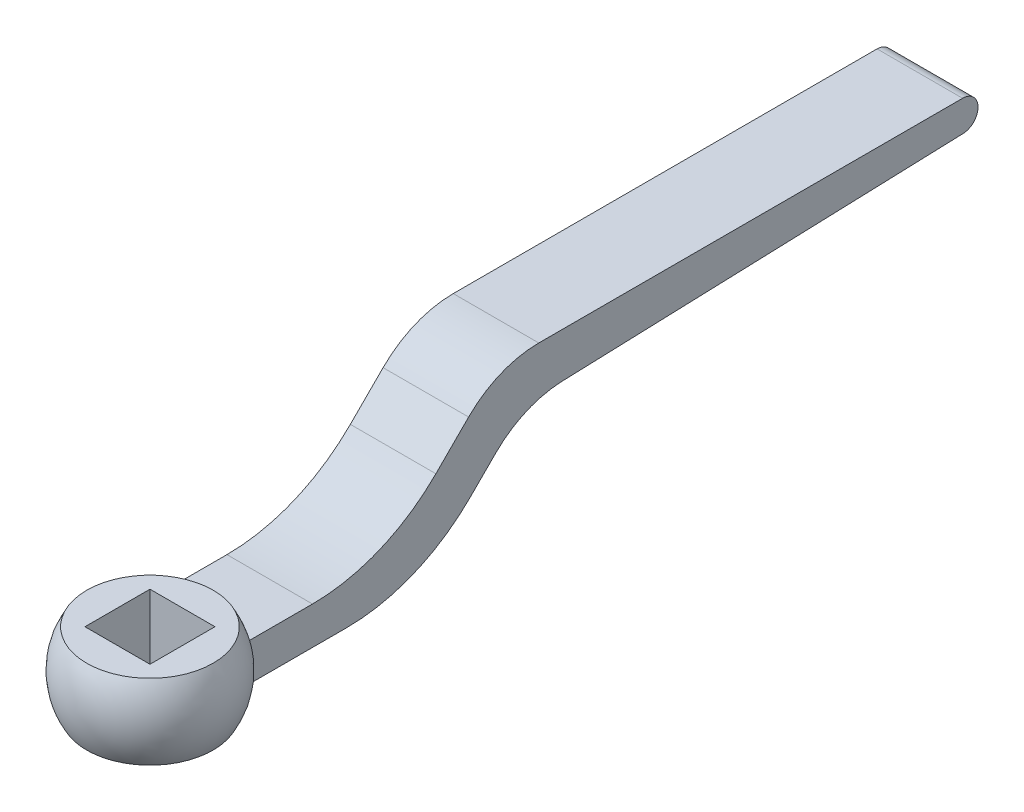
ISO-10303-21;
HEADER;
FILE_DESCRIPTION(('STEP AP214'),'2;1');
FILE_NAME('part.step','',(''),(''),'','','');
FILE_SCHEMA(('AUTOMOTIVE_DESIGN { 1 0 10303 214 1 1 1 1 }'));
ENDSEC;
DATA;
#1=APPLICATION_CONTEXT('core data for automotive mechanical design processes');
#2=APPLICATION_PROTOCOL_DEFINITION('international standard','automotive_design',2000,#1);
#3=PRODUCT_CONTEXT('',#1,'mechanical');
#4=PRODUCT('Part','Part','',(#3));
#5=PRODUCT_RELATED_PRODUCT_CATEGORY('part','',(#4));
#6=PRODUCT_DEFINITION_FORMATION('','',#4);
#7=PRODUCT_DEFINITION_CONTEXT('part definition',#1,'design');
#8=PRODUCT_DEFINITION('design','',#6,#7);
#9=PRODUCT_DEFINITION_SHAPE('','',#8);
#10=(LENGTH_UNIT() NAMED_UNIT(*) SI_UNIT(.MILLI.,.METRE.));
#11=(NAMED_UNIT(*) PLANE_ANGLE_UNIT() SI_UNIT($,.RADIAN.));
#12=(NAMED_UNIT(*) SI_UNIT($,.STERADIAN.) SOLID_ANGLE_UNIT());
#13=UNCERTAINTY_MEASURE_WITH_UNIT(LENGTH_MEASURE(1.E-05),#10,'distance_accuracy_value','');
#14=(GEOMETRIC_REPRESENTATION_CONTEXT(3) GLOBAL_UNCERTAINTY_ASSIGNED_CONTEXT((#13)) GLOBAL_UNIT_ASSIGNED_CONTEXT((#10,
#11,#12)) REPRESENTATION_CONTEXT('',''));
#15=CARTESIAN_POINT('',(0.,0.,0.));
#16=DIRECTION('',(0.,0.,1.));
#17=DIRECTION('',(1.,0.,0.));
#18=AXIS2_PLACEMENT_3D('',#15,#16,#17);
#19=CARTESIAN_POINT('',(0.,0.,15.));
#20=DIRECTION('',(0.,0.,1.));
#21=DIRECTION('',(0.,1.,0.));
#22=AXIS2_PLACEMENT_3D('',#19,#20,#21);
#23=SPHERICAL_SURFACE('',#22,21.5);
#24=CARTESIAN_POINT('',(0.,-11.,15.));
#25=DIRECTION('',(0.,1.,0.));
#26=DIRECTION('',(0.,0.,1.));
#27=AXIS2_PLACEMENT_3D('',#24,#25,#26);
#28=CIRCLE('',#27,18.4729532019112);
#29=CARTESIAN_POINT('',(0.,-11.,33.4729532019112));
#30=VERTEX_POINT('',#29);
#31=EDGE_CURVE('E54',#30,#30,#28,.T.);
#32=ORIENTED_EDGE('',*,*,#31,.T.);
#33=EDGE_LOOP('',(#32));
#34=FACE_BOUND('',#33,.T.);
#35=CARTESIAN_POINT('',(0.,11.,15.));
#36=DIRECTION('',(0.,-1.,0.));
#37=DIRECTION('',(0.,0.,-1.));
#38=AXIS2_PLACEMENT_3D('',#35,#36,#37);
#39=CIRCLE('',#38,18.4729532019112);
#40=CARTESIAN_POINT('',(0.,11.,-3.47295320191117));
#41=VERTEX_POINT('',#40);
#42=EDGE_CURVE('E334',#41,#41,#39,.T.);
#43=ORIENTED_EDGE('',*,*,#42,.T.);
#44=EDGE_LOOP('',(#43));
#45=FACE_BOUND('',#44,.T.);
#46=CARTESIAN_POINT('',(0.,-5.5,15.));
#47=DIRECTION('',(0.,1.,0.));
#48=DIRECTION('',(0.,0.,1.));
#49=AXIS2_PLACEMENT_3D('',#46,#47,#48);
#50=CIRCLE('',#49,20.7846096908265);
#51=CARTESIAN_POINT('',(-12.5,-5.5,-1.60572190541561));
#52=VERTEX_POINT('',#51);
#53=CARTESIAN_POINT('',(12.5,-5.5,-1.60572190541561));
#54=VERTEX_POINT('',#53);
#55=EDGE_CURVE('E216',#52,#54,#50,.F.);
#56=ORIENTED_EDGE('',*,*,#55,.T.);
#57=CARTESIAN_POINT('',(12.5,0.,15.));
#58=DIRECTION('',(-1.,0.,0.));
#59=DIRECTION('',(0.,0.,1.));
#60=AXIS2_PLACEMENT_3D('',#57,#58,#59);
#61=CIRCLE('',#60,17.4928556845359);
#62=CARTESIAN_POINT('',(12.5,5.5,-1.60572190541561));
#63=VERTEX_POINT('',#62);
#64=EDGE_CURVE('E219',#54,#63,#61,.F.);
#65=ORIENTED_EDGE('',*,*,#64,.T.);
#66=CARTESIAN_POINT('',(0.,5.5,15.));
#67=DIRECTION('',(0.,-1.,0.));
#68=DIRECTION('',(0.,0.,-1.));
#69=AXIS2_PLACEMENT_3D('',#66,#67,#68);
#70=CIRCLE('',#69,20.7846096908265);
#71=CARTESIAN_POINT('',(-12.5,5.5,-1.60572190541561));
#72=VERTEX_POINT('',#71);
#73=EDGE_CURVE('E213',#63,#72,#70,.F.);
#74=ORIENTED_EDGE('',*,*,#73,.T.);
#75=CARTESIAN_POINT('',(-12.5,0.,15.));
#76=DIRECTION('',(-1.,0.,0.));
#77=DIRECTION('',(0.,0.,1.));
#78=AXIS2_PLACEMENT_3D('',#75,#76,#77);
#79=CIRCLE('',#78,17.4928556845359);
#80=EDGE_CURVE('E330',#52,#72,#79,.F.);
#81=ORIENTED_EDGE('',*,*,#80,.F.);
#82=EDGE_LOOP('',(#56,#65,#74,#81));
#83=FACE_BOUND('',#82,.T.);
#84=ADVANCED_FACE('F45',(#34,#45,#83),#23,.T.);
#85=CARTESIAN_POINT('',(12.5,-5.5,-30.));
#86=DIRECTION('',(0.,1.,0.));
#87=DIRECTION('',(0.,0.,1.));
#88=AXIS2_PLACEMENT_3D('',#85,#86,#87);
#89=PLANE('',#88);
#90=CARTESIAN_POINT('',(-4.,-5.5,-8.00000000000001));
#91=DIRECTION('',(0.,1.,0.));
#92=DIRECTION('',(0.,0.,1.));
#93=AXIS2_PLACEMENT_3D('',#90,#91,#92);
#94=CIRCLE('',#93,1.5);
#95=CARTESIAN_POINT('',(-4.,-5.5,-6.50000000000001));
#96=VERTEX_POINT('',#95);
#97=EDGE_CURVE('E11',#96,#96,#94,.F.);
#98=ORIENTED_EDGE('',*,*,#97,.F.);
#99=EDGE_LOOP('',(#98));
#100=FACE_BOUND('',#99,.T.);
#101=ORIENTED_EDGE('',*,*,#55,.F.);
#102=DIRECTION('',(0.,0.,-1.));
#103=VECTOR('',#102,1.);
#104=CARTESIAN_POINT('',(-12.5,-5.5,-30.));
#105=LINE('',#104,#103);
#106=CARTESIAN_POINT('',(-12.5,-5.50000000000001,-30.));
#107=VERTEX_POINT('',#106);
#108=EDGE_CURVE('E222',#52,#107,#105,.T.);
#109=ORIENTED_EDGE('',*,*,#108,.T.);
#110=DIRECTION('',(-1.,0.,0.));
#111=VECTOR('',#110,1.);
#112=CARTESIAN_POINT('',(12.5,-5.50000000000001,-30.));
#113=LINE('',#112,#111);
#114=CARTESIAN_POINT('',(12.5,-5.50000000000001,-30.));
#115=VERTEX_POINT('',#114);
#116=EDGE_CURVE('E326',#115,#107,#113,.T.);
#117=ORIENTED_EDGE('',*,*,#116,.F.);
#118=DIRECTION('',(0.,0.,-1.));
#119=VECTOR('',#118,1.);
#120=CARTESIAN_POINT('',(12.5,-5.5,-30.));
#121=LINE('',#120,#119);
#122=EDGE_CURVE('E223',#54,#115,#121,.T.);
#123=ORIENTED_EDGE('',*,*,#122,.F.);
#124=EDGE_LOOP('',(#101,#109,#117,#123));
#125=FACE_BOUND('',#124,.T.);
#126=ADVANCED_FACE('F47',(#100,#125),#89,.F.);
#127=CARTESIAN_POINT('',(12.5,45.5,-30.));
#128=DIRECTION('',(-1.,0.,0.));
#129=DIRECTION('',(0.,0.,1.));
#130=AXIS2_PLACEMENT_3D('',#127,#128,#129);
#131=CYLINDRICAL_SURFACE('',#130,51.);
#132=CARTESIAN_POINT('',(-12.5,45.5,-30.));
#133=DIRECTION('',(1.,0.,0.));
#134=DIRECTION('',(0.,0.,1.));
#135=AXIS2_PLACEMENT_3D('',#132,#133,#134);
#136=CIRCLE('',#135,51.);
#137=CARTESIAN_POINT('',(-12.5,9.43755415948588,-66.0624458405137));
#138=VERTEX_POINT('',#137);
#139=EDGE_CURVE('E261',#107,#138,#136,.T.);
#140=ORIENTED_EDGE('',*,*,#139,.T.);
#141=DIRECTION('',(-1.,0.,0.));
#142=VECTOR('',#141,1.);
#143=CARTESIAN_POINT('',(12.5,9.43755415948588,-66.0624458405137));
#144=LINE('',#143,#142);
#145=CARTESIAN_POINT('',(12.5,9.43755415948588,-66.0624458405137));
#146=VERTEX_POINT('',#145);
#147=EDGE_CURVE('E322',#146,#138,#144,.T.);
#148=ORIENTED_EDGE('',*,*,#147,.F.);
#149=CARTESIAN_POINT('',(12.5,45.5,-30.));
#150=DIRECTION('',(1.,0.,0.));
#151=DIRECTION('',(0.,0.,1.));
#152=AXIS2_PLACEMENT_3D('',#149,#150,#151);
#153=CIRCLE('',#152,51.);
#154=EDGE_CURVE('E226',#115,#146,#153,.T.);
#155=ORIENTED_EDGE('',*,*,#154,.F.);
#156=ORIENTED_EDGE('',*,*,#116,.T.);
#157=EDGE_LOOP('',(#140,#148,#155,#156));
#158=FACE_BOUND('',#157,.T.);
#159=ADVANCED_FACE('F360',(#158),#131,.T.);
#160=CARTESIAN_POINT('',(12.5,16.9344084148553,-73.5593000958833));
#161=DIRECTION('',(0.,0.707106781186551,0.707106781186544));
#162=DIRECTION('',(0.,-0.707106781186544,0.707106781186551));
#163=AXIS2_PLACEMENT_3D('',#160,#161,#162);
#164=PLANE('',#163);
#165=DIRECTION('',(0.,0.707106781186544,-0.707106781186551));
#166=VECTOR('',#165,1.);
#167=CARTESIAN_POINT('',(-12.5,16.9344084148553,-73.5593000958833));
#168=LINE('',#167,#166);
#169=CARTESIAN_POINT('',(-12.5,16.9344084148553,-73.5593000958833));
#170=VERTEX_POINT('',#169);
#171=EDGE_CURVE('E264',#138,#170,#168,.T.);
#172=ORIENTED_EDGE('',*,*,#171,.T.);
#173=DIRECTION('',(-1.,0.,0.));
#174=VECTOR('',#173,1.);
#175=CARTESIAN_POINT('',(12.5,16.9344084148553,-73.5593000958833));
#176=LINE('',#175,#174);
#177=CARTESIAN_POINT('',(12.5,16.9344084148553,-73.5593000958833));
#178=VERTEX_POINT('',#177);
#179=EDGE_CURVE('E318',#178,#170,#176,.T.);
#180=ORIENTED_EDGE('',*,*,#179,.F.);
#181=DIRECTION('',(0.,0.707106781186544,-0.707106781186551));
#182=VECTOR('',#181,1.);
#183=CARTESIAN_POINT('',(12.5,16.9344084148553,-73.5593000958833));
#184=LINE('',#183,#182);
#185=EDGE_CURVE('E230',#146,#178,#184,.T.);
#186=ORIENTED_EDGE('',*,*,#185,.F.);
#187=ORIENTED_EDGE('',*,*,#147,.T.);
#188=EDGE_LOOP('',(#172,#180,#186,#187));
#189=FACE_BOUND('',#188,.T.);
#190=ADVANCED_FACE('F400',(#189),#164,.F.);
#191=CARTESIAN_POINT('',(12.5,-3.57168823955465,-94.065396750293));
#192=DIRECTION('',(-1.,0.,0.));
#193=DIRECTION('',(0.,0.,1.));
#194=AXIS2_PLACEMENT_3D('',#191,#192,#193);
#195=CYLINDRICAL_SURFACE('',#194,29.);
#196=CARTESIAN_POINT('',(-12.5,-3.57168823955465,-94.065396750293));
#197=DIRECTION('',(-1.,0.,0.));
#198=DIRECTION('',(0.,0.,-1.));
#199=AXIS2_PLACEMENT_3D('',#196,#197,#198);
#200=CIRCLE('',#199,29.);
#201=CARTESIAN_POINT('',(-12.5,25.4106457439991,-93.0533113459207));
#202=VERTEX_POINT('',#201);
#203=EDGE_CURVE('E267',#170,#202,#200,.T.);
#204=ORIENTED_EDGE('',*,*,#203,.T.);
#205=DIRECTION('',(-1.,0.,0.));
#206=VECTOR('',#205,1.);
#207=CARTESIAN_POINT('',(12.5,25.4106457439991,-93.0533113459207));
#208=LINE('',#207,#206);
#209=CARTESIAN_POINT('',(12.5,25.4106457439991,-93.0533113459207));
#210=VERTEX_POINT('',#209);
#211=EDGE_CURVE('E314',#210,#202,#208,.T.);
#212=ORIENTED_EDGE('',*,*,#211,.F.);
#213=CARTESIAN_POINT('',(12.5,-3.57168823955465,-94.065396750293));
#214=DIRECTION('',(-1.,0.,0.));
#215=DIRECTION('',(0.,0.,-1.));
#216=AXIS2_PLACEMENT_3D('',#213,#214,#215);
#217=CIRCLE('',#216,29.);
#218=EDGE_CURVE('E233',#178,#210,#217,.T.);
#219=ORIENTED_EDGE('',*,*,#218,.F.);
#220=ORIENTED_EDGE('',*,*,#179,.T.);
#221=EDGE_LOOP('',(#204,#212,#219,#220));
#222=FACE_BOUND('',#221,.T.);
#223=ADVANCED_FACE('F396',(#222),#195,.F.);
#224=CARTESIAN_POINT('',(12.5,29.5,-210.157095584354));
#225=DIRECTION('',(0.,0.999390827019096,0.0348994967024941));
#226=DIRECTION('',(0.,-0.0348994967024941,0.999390827019096));
#227=AXIS2_PLACEMENT_3D('',#224,#225,#226);
#228=PLANE('',#227);
#229=DIRECTION('',(0.,0.0348994967024941,-0.999390827019096));
#230=VECTOR('',#229,1.);
#231=CARTESIAN_POINT('',(-12.5,29.5,-210.157095584354));
#232=LINE('',#231,#230);
#233=CARTESIAN_POINT('',(-12.5,29.5,-210.157095584354));
#234=VERTEX_POINT('',#233);
#235=EDGE_CURVE('E270',#202,#234,#232,.T.);
#236=ORIENTED_EDGE('',*,*,#235,.T.);
#237=DIRECTION('',(-1.,0.,0.));
#238=VECTOR('',#237,1.);
#239=CARTESIAN_POINT('',(12.5,29.5,-210.157095584354));
#240=LINE('',#239,#238);
#241=CARTESIAN_POINT('',(12.5,29.5,-210.157095584354));
#242=VERTEX_POINT('',#241);
#243=EDGE_CURVE('E310',#242,#234,#240,.T.);
#244=ORIENTED_EDGE('',*,*,#243,.F.);
#245=DIRECTION('',(0.,0.0348994967024941,-0.999390827019096));
#246=VECTOR('',#245,1.);
#247=CARTESIAN_POINT('',(12.5,29.5,-210.157095584354));
#248=LINE('',#247,#246);
#249=EDGE_CURVE('E236',#210,#242,#248,.T.);
#250=ORIENTED_EDGE('',*,*,#249,.F.);
#251=ORIENTED_EDGE('',*,*,#211,.T.);
#252=EDGE_LOOP('',(#236,#244,#250,#251));
#253=FACE_BOUND('',#252,.T.);
#254=ADVANCED_FACE('F392',(#253),#228,.F.);
#255=CARTESIAN_POINT('',(12.5,33.9986289431876,-210.));
#256=DIRECTION('',(-1.,0.,0.));
#257=DIRECTION('',(0.,0.,1.));
#258=AXIS2_PLACEMENT_3D('',#255,#256,#257);
#259=CYLINDRICAL_SURFACE('',#258,4.50137105681242);
#260=CARTESIAN_POINT('',(-12.5,33.9986289431876,-210.));
#261=DIRECTION('',(1.,0.,0.));
#262=DIRECTION('',(0.,0.,-1.));
#263=AXIS2_PLACEMENT_3D('',#260,#261,#262);
#264=CIRCLE('',#263,4.50137105681242);
#265=CARTESIAN_POINT('',(-12.5,38.5,-210.));
#266=VERTEX_POINT('',#265);
#267=EDGE_CURVE('E273',#234,#266,#264,.T.);
#268=ORIENTED_EDGE('',*,*,#267,.T.);
#269=DIRECTION('',(-1.,0.,0.));
#270=VECTOR('',#269,1.);
#271=CARTESIAN_POINT('',(12.5,38.5,-210.));
#272=LINE('',#271,#270);
#273=CARTESIAN_POINT('',(12.5,38.5,-210.));
#274=VERTEX_POINT('',#273);
#275=EDGE_CURVE('E306',#274,#266,#272,.T.);
#276=ORIENTED_EDGE('',*,*,#275,.F.);
#277=CARTESIAN_POINT('',(12.5,33.9986289431876,-210.));
#278=DIRECTION('',(1.,0.,0.));
#279=DIRECTION('',(0.,0.,-1.));
#280=AXIS2_PLACEMENT_3D('',#277,#278,#279);
#281=CIRCLE('',#280,4.50137105681242);
#282=EDGE_CURVE('E239',#242,#274,#281,.T.);
#283=ORIENTED_EDGE('',*,*,#282,.F.);
#284=ORIENTED_EDGE('',*,*,#243,.T.);
#285=EDGE_LOOP('',(#268,#276,#283,#284));
#286=FACE_BOUND('',#285,.T.);
#287=ADVANCED_FACE('F388',(#286),#259,.T.);
#288=CARTESIAN_POINT('',(12.5,38.5,-86.1370849898477));
#289=DIRECTION('',(0.,-1.,0.));
#290=DIRECTION('',(0.,0.,-1.));
#291=AXIS2_PLACEMENT_3D('',#288,#289,#290);
#292=PLANE('',#291);
#293=DIRECTION('',(0.,0.,1.));
#294=VECTOR('',#293,1.);
#295=CARTESIAN_POINT('',(-12.5,38.5,-86.1370849898477));
#296=LINE('',#295,#294);
#297=CARTESIAN_POINT('',(-12.5,38.5,-86.1370849898477));
#298=VERTEX_POINT('',#297);
#299=EDGE_CURVE('E276',#266,#298,#296,.T.);
#300=ORIENTED_EDGE('',*,*,#299,.T.);
#301=DIRECTION('',(-1.,0.,0.));
#302=VECTOR('',#301,1.);
#303=CARTESIAN_POINT('',(12.5,38.5,-86.1370849898477));
#304=LINE('',#303,#302);
#305=CARTESIAN_POINT('',(12.5,38.5,-86.1370849898477));
#306=VERTEX_POINT('',#305);
#307=EDGE_CURVE('E302',#306,#298,#304,.T.);
#308=ORIENTED_EDGE('',*,*,#307,.F.);
#309=DIRECTION('',(0.,0.,1.));
#310=VECTOR('',#309,1.);
#311=CARTESIAN_POINT('',(12.5,38.5,-86.1370849898477));
#312=LINE('',#311,#310);
#313=EDGE_CURVE('E242',#274,#306,#312,.T.);
#314=ORIENTED_EDGE('',*,*,#313,.F.);
#315=ORIENTED_EDGE('',*,*,#275,.T.);
#316=EDGE_LOOP('',(#300,#308,#314,#315));
#317=FACE_BOUND('',#316,.T.);
#318=ADVANCED_FACE('F384',(#317),#292,.F.);
#319=CARTESIAN_POINT('',(12.5,9.5,-86.1370849898477));
#320=DIRECTION('',(-1.,0.,0.));
#321=DIRECTION('',(0.,0.,1.));
#322=AXIS2_PLACEMENT_3D('',#319,#320,#321);
#323=CYLINDRICAL_SURFACE('',#322,29.);
#324=CARTESIAN_POINT('',(-12.5,9.5,-86.1370849898477));
#325=DIRECTION('',(1.,0.,0.));
#326=DIRECTION('',(0.,0.,-1.));
#327=AXIS2_PLACEMENT_3D('',#324,#325,#326);
#328=CIRCLE('',#327,29.);
#329=CARTESIAN_POINT('',(-12.5,30.00609665441,-65.6309883354379));
#330=VERTEX_POINT('',#329);
#331=EDGE_CURVE('E279',#298,#330,#328,.T.);
#332=ORIENTED_EDGE('',*,*,#331,.T.);
#333=DIRECTION('',(-1.,0.,0.));
#334=VECTOR('',#333,1.);
#335=CARTESIAN_POINT('',(12.5,30.00609665441,-65.6309883354379));
#336=LINE('',#335,#334);
#337=CARTESIAN_POINT('',(12.5,30.00609665441,-65.6309883354379));
#338=VERTEX_POINT('',#337);
#339=EDGE_CURVE('E298',#338,#330,#336,.T.);
#340=ORIENTED_EDGE('',*,*,#339,.F.);
#341=CARTESIAN_POINT('',(12.5,9.5,-86.1370849898477));
#342=DIRECTION('',(1.,0.,0.));
#343=DIRECTION('',(0.,0.,-1.));
#344=AXIS2_PLACEMENT_3D('',#341,#342,#343);
#345=CIRCLE('',#344,29.);
#346=EDGE_CURVE('E245',#306,#338,#345,.T.);
#347=ORIENTED_EDGE('',*,*,#346,.F.);
#348=ORIENTED_EDGE('',*,*,#307,.T.);
#349=EDGE_LOOP('',(#332,#340,#347,#348));
#350=FACE_BOUND('',#349,.T.);
#351=ADVANCED_FACE('F380',(#350),#323,.T.);
#352=CARTESIAN_POINT('',(12.5,20.4375541594859,-56.0624458405137));
#353=DIRECTION('',(0.,-0.707106781186552,-0.707106781186543));
#354=DIRECTION('',(0.,0.707106781186543,-0.707106781186552));
#355=AXIS2_PLACEMENT_3D('',#352,#353,#354);
#356=PLANE('',#355);
#357=DIRECTION('',(0.,-0.707106781186543,0.707106781186552));
#358=VECTOR('',#357,1.);
#359=CARTESIAN_POINT('',(-12.5,20.4375541594859,-56.0624458405137));
#360=LINE('',#359,#358);
#361=CARTESIAN_POINT('',(-12.5,20.4375541594859,-56.0624458405137));
#362=VERTEX_POINT('',#361);
#363=EDGE_CURVE('E282',#330,#362,#360,.T.);
#364=ORIENTED_EDGE('',*,*,#363,.T.);
#365=DIRECTION('',(-1.,0.,0.));
#366=VECTOR('',#365,1.);
#367=CARTESIAN_POINT('',(12.5,20.4375541594859,-56.0624458405137));
#368=LINE('',#367,#366);
#369=CARTESIAN_POINT('',(12.5,20.4375541594859,-56.0624458405137));
#370=VERTEX_POINT('',#369);
#371=EDGE_CURVE('E294',#370,#362,#368,.T.);
#372=ORIENTED_EDGE('',*,*,#371,.F.);
#373=DIRECTION('',(0.,-0.707106781186543,0.707106781186552));
#374=VECTOR('',#373,1.);
#375=CARTESIAN_POINT('',(12.5,20.4375541594859,-56.0624458405137));
#376=LINE('',#375,#374);
#377=EDGE_CURVE('E248',#338,#370,#376,.T.);
#378=ORIENTED_EDGE('',*,*,#377,.F.);
#379=ORIENTED_EDGE('',*,*,#339,.T.);
#380=EDGE_LOOP('',(#364,#372,#378,#379));
#381=FACE_BOUND('',#380,.T.);
#382=ADVANCED_FACE('F376',(#381),#356,.F.);
#383=CARTESIAN_POINT('',(12.5,56.5,-20.));
#384=DIRECTION('',(-1.,0.,0.));
#385=DIRECTION('',(0.,0.,1.));
#386=AXIS2_PLACEMENT_3D('',#383,#384,#385);
#387=CYLINDRICAL_SURFACE('',#386,51.);
#388=CARTESIAN_POINT('',(-12.5,56.5,-20.));
#389=DIRECTION('',(-1.,0.,0.));
#390=DIRECTION('',(0.,0.,1.));
#391=AXIS2_PLACEMENT_3D('',#388,#389,#390);
#392=CIRCLE('',#391,51.);
#393=CARTESIAN_POINT('',(-12.5,5.5,-20.));
#394=VERTEX_POINT('',#393);
#395=EDGE_CURVE('E285',#362,#394,#392,.T.);
#396=ORIENTED_EDGE('',*,*,#395,.T.);
#397=DIRECTION('',(-1.,0.,0.));
#398=VECTOR('',#397,1.);
#399=CARTESIAN_POINT('',(12.5,5.5,-20.));
#400=LINE('',#399,#398);
#401=CARTESIAN_POINT('',(12.5,5.5,-20.));
#402=VERTEX_POINT('',#401);
#403=EDGE_CURVE('E258',#402,#394,#400,.T.);
#404=ORIENTED_EDGE('',*,*,#403,.F.);
#405=CARTESIAN_POINT('',(12.5,56.5,-20.));
#406=DIRECTION('',(-1.,0.,0.));
#407=DIRECTION('',(0.,0.,1.));
#408=AXIS2_PLACEMENT_3D('',#405,#406,#407);
#409=CIRCLE('',#408,51.);
#410=EDGE_CURVE('E251',#370,#402,#409,.T.);
#411=ORIENTED_EDGE('',*,*,#410,.F.);
#412=ORIENTED_EDGE('',*,*,#371,.T.);
#413=EDGE_LOOP('',(#396,#404,#411,#412));
#414=FACE_BOUND('',#413,.T.);
#415=ADVANCED_FACE('F372',(#414),#387,.F.);
#416=CARTESIAN_POINT('',(12.5,5.5,0.));
#417=DIRECTION('',(0.,-1.,0.));
#418=DIRECTION('',(0.,0.,-1.));
#419=AXIS2_PLACEMENT_3D('',#416,#417,#418);
#420=PLANE('',#419);
#421=ORIENTED_EDGE('',*,*,#73,.F.);
#422=DIRECTION('',(0.,0.,1.));
#423=VECTOR('',#422,1.);
#424=CARTESIAN_POINT('',(12.5,5.5,0.));
#425=LINE('',#424,#423);
#426=EDGE_CURVE('E254',#402,#63,#425,.T.);
#427=ORIENTED_EDGE('',*,*,#426,.F.);
#428=ORIENTED_EDGE('',*,*,#403,.T.);
#429=DIRECTION('',(0.,0.,1.));
#430=VECTOR('',#429,1.);
#431=CARTESIAN_POINT('',(-12.5,5.5,0.));
#432=LINE('',#431,#430);
#433=EDGE_CURVE('E227',#394,#72,#432,.T.);
#434=ORIENTED_EDGE('',*,*,#433,.T.);
#435=EDGE_LOOP('',(#421,#427,#428,#434));
#436=FACE_BOUND('',#435,.T.);
#437=ADVANCED_FACE('F366',(#436),#420,.F.);
#438=CARTESIAN_POINT('',(12.5,56.5,-20.));
#439=DIRECTION('',(-1.,0.,0.));
#440=DIRECTION('',(0.,0.,1.));
#441=AXIS2_PLACEMENT_3D('',#438,#439,#440);
#442=PLANE('',#441);
#443=ORIENTED_EDGE('',*,*,#64,.F.);
#444=ORIENTED_EDGE('',*,*,#122,.T.);
#445=ORIENTED_EDGE('',*,*,#154,.T.);
#446=ORIENTED_EDGE('',*,*,#185,.T.);
#447=ORIENTED_EDGE('',*,*,#218,.T.);
#448=ORIENTED_EDGE('',*,*,#249,.T.);
#449=ORIENTED_EDGE('',*,*,#282,.T.);
#450=ORIENTED_EDGE('',*,*,#313,.T.);
#451=ORIENTED_EDGE('',*,*,#346,.T.);
#452=ORIENTED_EDGE('',*,*,#377,.T.);
#453=ORIENTED_EDGE('',*,*,#410,.T.);
#454=ORIENTED_EDGE('',*,*,#426,.T.);
#455=EDGE_LOOP('',(#443,#444,#445,#446,#447,#448,#449,#450,#451,#452,#453,#454));
#456=FACE_BOUND('',#455,.T.);
#457=ADVANCED_FACE('F363',(#456),#442,.F.);
#458=CARTESIAN_POINT('',(-12.5,56.5,-20.));
#459=DIRECTION('',(-1.,0.,0.));
#460=DIRECTION('',(0.,0.,1.));
#461=AXIS2_PLACEMENT_3D('',#458,#459,#460);
#462=PLANE('',#461);
#463=ORIENTED_EDGE('',*,*,#108,.F.);
#464=ORIENTED_EDGE('',*,*,#80,.T.);
#465=ORIENTED_EDGE('',*,*,#433,.F.);
#466=ORIENTED_EDGE('',*,*,#395,.F.);
#467=ORIENTED_EDGE('',*,*,#363,.F.);
#468=ORIENTED_EDGE('',*,*,#331,.F.);
#469=ORIENTED_EDGE('',*,*,#299,.F.);
#470=ORIENTED_EDGE('',*,*,#267,.F.);
#471=ORIENTED_EDGE('',*,*,#235,.F.);
#472=ORIENTED_EDGE('',*,*,#203,.F.);
#473=ORIENTED_EDGE('',*,*,#171,.F.);
#474=ORIENTED_EDGE('',*,*,#139,.F.);
#475=EDGE_LOOP('',(#463,#464,#465,#466,#467,#468,#469,#470,#471,#472,#473,#474));
#476=FACE_BOUND('',#475,.T.);
#477=ADVANCED_FACE('F351',(#476),#462,.T.);
#478=CARTESIAN_POINT('',(-21.5,11.,33.4729532019112));
#479=DIRECTION('',(0.,-1.,0.));
#480=DIRECTION('',(0.,0.,-1.));
#481=AXIS2_PLACEMENT_3D('',#478,#479,#480);
#482=PLANE('',#481);
#483=DIRECTION('',(1.,0.,0.));
#484=VECTOR('',#483,1.);
#485=CARTESIAN_POINT('',(-21.5,11.,5.50000000000001));
#486=LINE('',#485,#484);
#487=CARTESIAN_POINT('',(-9.5,11.,5.5));
#488=VERTEX_POINT('',#487);
#489=CARTESIAN_POINT('',(9.5,11.,5.50000000000001));
#490=VERTEX_POINT('',#489);
#491=EDGE_CURVE('E194',#488,#490,#486,.T.);
#492=ORIENTED_EDGE('',*,*,#491,.T.);
#493=DIRECTION('',(0.,0.,1.));
#494=VECTOR('',#493,1.);
#495=CARTESIAN_POINT('',(9.50000000000001,11.,33.4729532019112));
#496=LINE('',#495,#494);
#497=CARTESIAN_POINT('',(9.5,11.,24.5));
#498=VERTEX_POINT('',#497);
#499=EDGE_CURVE('E165',#490,#498,#496,.T.);
#500=ORIENTED_EDGE('',*,*,#499,.T.);
#501=DIRECTION('',(-1.,0.,0.));
#502=VECTOR('',#501,1.);
#503=CARTESIAN_POINT('',(-21.5,11.,24.5));
#504=LINE('',#503,#502);
#505=CARTESIAN_POINT('',(-9.5,11.,24.5));
#506=VERTEX_POINT('',#505);
#507=EDGE_CURVE('E207',#498,#506,#504,.T.);
#508=ORIENTED_EDGE('',*,*,#507,.T.);
#509=DIRECTION('',(0.,0.,-1.));
#510=VECTOR('',#509,1.);
#511=CARTESIAN_POINT('',(-9.49999999999999,11.,33.4729532019112));
#512=LINE('',#511,#510);
#513=EDGE_CURVE('E203',#506,#488,#512,.T.);
#514=ORIENTED_EDGE('',*,*,#513,.T.);
#515=EDGE_LOOP('',(#492,#500,#508,#514));
#516=FACE_BOUND('',#515,.T.);
#517=ORIENTED_EDGE('',*,*,#42,.F.);
#518=EDGE_LOOP('',(#517));
#519=FACE_BOUND('',#518,.T.);
#520=ADVANCED_FACE('F343',(#516,#519),#482,.F.);
#521=CARTESIAN_POINT('',(-21.5,-11.,33.4729532019112));
#522=DIRECTION('',(0.,1.,0.));
#523=DIRECTION('',(0.,0.,1.));
#524=AXIS2_PLACEMENT_3D('',#521,#522,#523);
#525=PLANE('',#524);
#526=DIRECTION('',(1.,0.,0.));
#527=VECTOR('',#526,1.);
#528=CARTESIAN_POINT('',(-9.5,-11.,24.5));
#529=LINE('',#528,#527);
#530=CARTESIAN_POINT('',(-9.5,-11.,24.5));
#531=VERTEX_POINT('',#530);
#532=CARTESIAN_POINT('',(9.5,-11.,24.5));
#533=VERTEX_POINT('',#532);
#534=EDGE_CURVE('E169',#531,#533,#529,.T.);
#535=ORIENTED_EDGE('',*,*,#534,.T.);
#536=DIRECTION('',(0.,0.,-1.));
#537=VECTOR('',#536,1.);
#538=CARTESIAN_POINT('',(9.5,-11.,5.5));
#539=LINE('',#538,#537);
#540=CARTESIAN_POINT('',(9.5,-11.,5.5));
#541=VERTEX_POINT('',#540);
#542=EDGE_CURVE('E162',#533,#541,#539,.T.);
#543=ORIENTED_EDGE('',*,*,#542,.T.);
#544=DIRECTION('',(-1.,0.,0.));
#545=VECTOR('',#544,1.);
#546=CARTESIAN_POINT('',(-9.5,-11.,5.5));
#547=LINE('',#546,#545);
#548=CARTESIAN_POINT('',(-9.5,-11.,5.5));
#549=VERTEX_POINT('',#548);
#550=EDGE_CURVE('E172',#541,#549,#547,.T.);
#551=ORIENTED_EDGE('',*,*,#550,.T.);
#552=DIRECTION('',(0.,0.,1.));
#553=VECTOR('',#552,1.);
#554=CARTESIAN_POINT('',(-9.5,-11.,5.5));
#555=LINE('',#554,#553);
#556=EDGE_CURVE('E69',#549,#531,#555,.T.);
#557=ORIENTED_EDGE('',*,*,#556,.T.);
#558=EDGE_LOOP('',(#535,#543,#551,#557));
#559=FACE_BOUND('',#558,.T.);
#560=ORIENTED_EDGE('',*,*,#31,.F.);
#561=EDGE_LOOP('',(#560));
#562=FACE_BOUND('',#561,.T.);
#563=ADVANCED_FACE('F177',(#559,#562),#525,.F.);
#564=CARTESIAN_POINT('',(9.5,-11.,5.5));
#565=DIRECTION('',(1.,0.,0.));
#566=DIRECTION('',(0.,0.,-1.));
#567=AXIS2_PLACEMENT_3D('',#564,#565,#566);
#568=PLANE('',#567);
#569=DIRECTION('',(0.,1.,0.));
#570=VECTOR('',#569,1.);
#571=CARTESIAN_POINT('',(9.5,-11.,5.5));
#572=LINE('',#571,#570);
#573=EDGE_CURVE('E61',#541,#490,#572,.T.);
#574=ORIENTED_EDGE('',*,*,#573,.F.);
#575=ORIENTED_EDGE('',*,*,#542,.F.);
#576=DIRECTION('',(0.,1.,0.));
#577=VECTOR('',#576,1.);
#578=CARTESIAN_POINT('',(9.5,-11.,24.5));
#579=LINE('',#578,#577);
#580=EDGE_CURVE('E191',#533,#498,#579,.T.);
#581=ORIENTED_EDGE('',*,*,#580,.T.);
#582=ORIENTED_EDGE('',*,*,#499,.F.);
#583=EDGE_LOOP('',(#574,#575,#581,#582));
#584=FACE_BOUND('',#583,.T.);
#585=ADVANCED_FACE('F159',(#584),#568,.F.);
#586=CARTESIAN_POINT('',(-9.5,-11.,24.5));
#587=DIRECTION('',(0.,0.,1.));
#588=DIRECTION('',(0.,-1.,0.));
#589=AXIS2_PLACEMENT_3D('',#586,#587,#588);
#590=PLANE('',#589);
#591=ORIENTED_EDGE('',*,*,#580,.F.);
#592=ORIENTED_EDGE('',*,*,#534,.F.);
#593=DIRECTION('',(0.,1.,0.));
#594=VECTOR('',#593,1.);
#595=CARTESIAN_POINT('',(-9.5,-11.,24.5));
#596=LINE('',#595,#594);
#597=EDGE_CURVE('E195',#531,#506,#596,.T.);
#598=ORIENTED_EDGE('',*,*,#597,.T.);
#599=ORIENTED_EDGE('',*,*,#507,.F.);
#600=EDGE_LOOP('',(#591,#592,#598,#599));
#601=FACE_BOUND('',#600,.T.);
#602=ADVANCED_FACE('F349',(#601),#590,.F.);
#603=CARTESIAN_POINT('',(-9.5,-11.,5.5));
#604=DIRECTION('',(-1.,0.,0.));
#605=DIRECTION('',(0.,0.,1.));
#606=AXIS2_PLACEMENT_3D('',#603,#604,#605);
#607=PLANE('',#606);
#608=ORIENTED_EDGE('',*,*,#597,.F.);
#609=ORIENTED_EDGE('',*,*,#556,.F.);
#610=DIRECTION('',(0.,1.,0.));
#611=VECTOR('',#610,1.);
#612=CARTESIAN_POINT('',(-9.5,-11.,5.5));
#613=LINE('',#612,#611);
#614=EDGE_CURVE('E168',#549,#488,#613,.T.);
#615=ORIENTED_EDGE('',*,*,#614,.T.);
#616=ORIENTED_EDGE('',*,*,#513,.F.);
#617=EDGE_LOOP('',(#608,#609,#615,#616));
#618=FACE_BOUND('',#617,.T.);
#619=ADVANCED_FACE('F531',(#618),#607,.F.);
#620=CARTESIAN_POINT('',(-9.5,-11.,5.5));
#621=DIRECTION('',(0.,0.,-1.));
#622=DIRECTION('',(0.,1.,0.));
#623=AXIS2_PLACEMENT_3D('',#620,#621,#622);
#624=PLANE('',#623);
#625=ORIENTED_EDGE('',*,*,#614,.F.);
#626=ORIENTED_EDGE('',*,*,#550,.F.);
#627=ORIENTED_EDGE('',*,*,#573,.T.);
#628=ORIENTED_EDGE('',*,*,#491,.F.);
#629=EDGE_LOOP('',(#625,#626,#627,#628));
#630=FACE_BOUND('',#629,.T.);
#631=ADVANCED_FACE('F173',(#630),#624,.F.);
#632=CARTESIAN_POINT('',(-4.,-13.,-8.00000000000001));
#633=DIRECTION('',(0.,1.,0.));
#634=DIRECTION('',(0.,0.,1.));
#635=AXIS2_PLACEMENT_3D('',#632,#633,#634);
#636=CYLINDRICAL_SURFACE('',#635,1.5);
#637=CARTESIAN_POINT('',(-4.,-13.,-8.00000000000001));
#638=DIRECTION('',(0.,-1.,0.));
#639=DIRECTION('',(0.,0.,-1.));
#640=AXIS2_PLACEMENT_3D('',#637,#638,#639);
#641=CIRCLE('',#640,1.5);
#642=CARTESIAN_POINT('',(-4.,-13.,-9.50000000000001));
#643=VERTEX_POINT('',#642);
#644=EDGE_CURVE('E181',#643,#643,#641,.T.);
#645=ORIENTED_EDGE('',*,*,#644,.F.);
#646=EDGE_LOOP('',(#645));
#647=FACE_BOUND('',#646,.T.);
#648=ORIENTED_EDGE('',*,*,#97,.T.);
#649=EDGE_LOOP('',(#648));
#650=FACE_BOUND('',#649,.T.);
#651=ADVANCED_FACE('F549',(#647,#650),#636,.T.);
#652=CARTESIAN_POINT('',(-4.,-13.,-8.00000000000001));
#653=DIRECTION('',(0.,-1.,0.));
#654=DIRECTION('',(0.,0.,-1.));
#655=AXIS2_PLACEMENT_3D('',#652,#653,#654);
#656=PLANE('',#655);
#657=ORIENTED_EDGE('',*,*,#644,.T.);
#658=EDGE_LOOP('',(#657));
#659=FACE_BOUND('',#658,.T.);
#660=ADVANCED_FACE('F558',(#659),#656,.T.);
#661=CLOSED_SHELL('',(#84,#126,#159,#190,#223,#254,#287,#318,#351,#382,#415,#437,#457,#477,#520,
#563,#585,#602,#619,#631,#651,#660));
#662=MANIFOLD_SOLID_BREP('B2',#661);
#663=ADVANCED_BREP_SHAPE_REPRESENTATION('',(#18,#662),#14);
#664=SHAPE_DEFINITION_REPRESENTATION(#9,#663);
ENDSEC;
END-ISO-10303-21;
